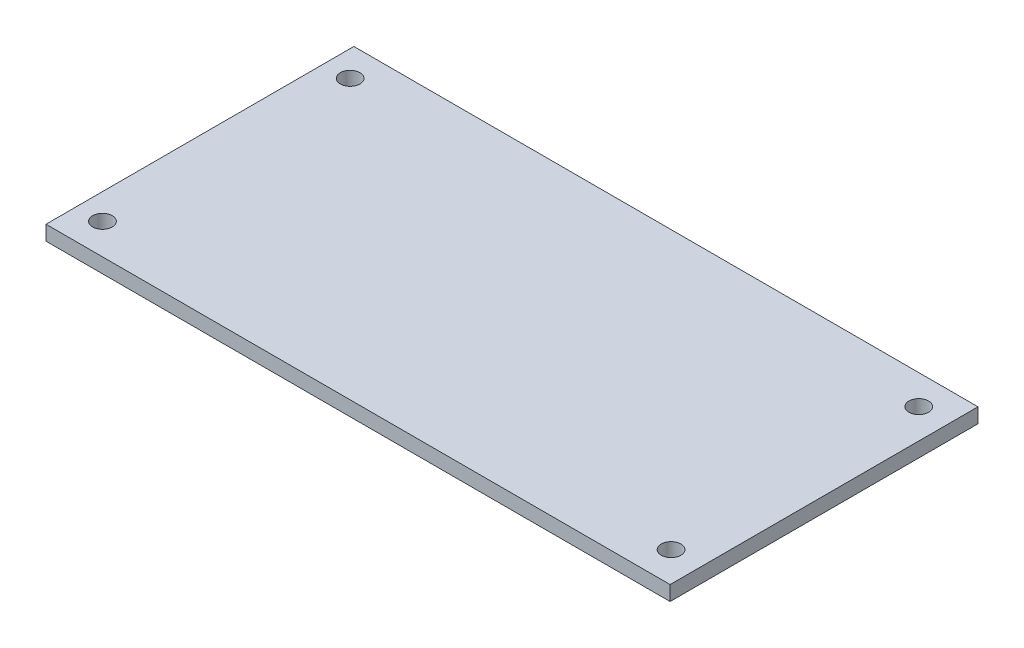
ISO-10303-21;
HEADER;
FILE_DESCRIPTION(('STEP AP214'),'2;1');
FILE_NAME('part.step','',(''),(''),'','','');
FILE_SCHEMA(('AUTOMOTIVE_DESIGN { 1 0 10303 214 1 1 1 1 }'));
ENDSEC;
DATA;
#1=APPLICATION_CONTEXT('core data for automotive mechanical design processes');
#2=APPLICATION_PROTOCOL_DEFINITION('international standard','automotive_design',2000,#1);
#3=PRODUCT_CONTEXT('',#1,'mechanical');
#4=PRODUCT('Part','Part','',(#3));
#5=PRODUCT_RELATED_PRODUCT_CATEGORY('part','',(#4));
#6=PRODUCT_DEFINITION_FORMATION('','',#4);
#7=PRODUCT_DEFINITION_CONTEXT('part definition',#1,'design');
#8=PRODUCT_DEFINITION('design','',#6,#7);
#9=PRODUCT_DEFINITION_SHAPE('','',#8);
#10=(LENGTH_UNIT() NAMED_UNIT(*) SI_UNIT(.MILLI.,.METRE.));
#11=(NAMED_UNIT(*) PLANE_ANGLE_UNIT() SI_UNIT($,.RADIAN.));
#12=(NAMED_UNIT(*) SI_UNIT($,.STERADIAN.) SOLID_ANGLE_UNIT());
#13=UNCERTAINTY_MEASURE_WITH_UNIT(LENGTH_MEASURE(1.E-05),#10,'distance_accuracy_value','');
#14=(GEOMETRIC_REPRESENTATION_CONTEXT(3) GLOBAL_UNCERTAINTY_ASSIGNED_CONTEXT((#13)) GLOBAL_UNIT_ASSIGNED_CONTEXT((#10,
#11,#12)) REPRESENTATION_CONTEXT('',''));
#15=CARTESIAN_POINT('',(0.,0.,0.));
#16=DIRECTION('',(0.,0.,1.));
#17=DIRECTION('',(1.,0.,0.));
#18=AXIS2_PLACEMENT_3D('',#15,#16,#17);
#19=CARTESIAN_POINT('',(0.,3.,0.));
#20=DIRECTION('',(0.,1.,0.));
#21=DIRECTION('',(0.,0.,1.));
#22=AXIS2_PLACEMENT_3D('',#19,#20,#21);
#23=PLANE('',#22);
#24=CARTESIAN_POINT('',(-58.3565,3.,25.11425));
#25=DIRECTION('',(0.,1.,0.));
#26=DIRECTION('',(0.,0.,1.));
#27=AXIS2_PLACEMENT_3D('',#24,#25,#26);
#28=CIRCLE('',#27,1.99999854);
#29=CARTESIAN_POINT('',(-58.3565,3.,27.11424854));
#30=VERTEX_POINT('',#29);
#31=EDGE_CURVE('E122',#30,#30,#28,.T.);
#32=ORIENTED_EDGE('',*,*,#31,.F.);
#33=EDGE_LOOP('',(#32));
#34=FACE_BOUND('',#33,.T.);
#35=CARTESIAN_POINT('',(57.531,3.,-25.36825));
#36=DIRECTION('',(0.,1.,0.));
#37=DIRECTION('',(0.,0.,1.));
#38=AXIS2_PLACEMENT_3D('',#35,#36,#37);
#39=CIRCLE('',#38,1.99999853999999);
#40=CARTESIAN_POINT('',(57.531,3.,-23.36825146));
#41=VERTEX_POINT('',#40);
#42=EDGE_CURVE('E101',#41,#41,#39,.T.);
#43=ORIENTED_EDGE('',*,*,#42,.F.);
#44=EDGE_LOOP('',(#43));
#45=FACE_BOUND('',#44,.T.);
#46=DIRECTION('',(0.,0.,-1.));
#47=VECTOR('',#46,1.);
#48=CARTESIAN_POINT('',(63.6,3.,-31.375));
#49=LINE('',#48,#47);
#50=CARTESIAN_POINT('',(63.6,3.,31.375));
#51=VERTEX_POINT('',#50);
#52=CARTESIAN_POINT('',(63.6,3.,-31.375));
#53=VERTEX_POINT('',#52);
#54=EDGE_CURVE('E86',#51,#53,#49,.T.);
#55=ORIENTED_EDGE('',*,*,#54,.T.);
#56=DIRECTION('',(-1.,0.,0.));
#57=VECTOR('',#56,1.);
#58=CARTESIAN_POINT('',(-63.6,3.,-31.375));
#59=LINE('',#58,#57);
#60=CARTESIAN_POINT('',(-63.6,3.,-31.375));
#61=VERTEX_POINT('',#60);
#62=EDGE_CURVE('E81',#53,#61,#59,.T.);
#63=ORIENTED_EDGE('',*,*,#62,.T.);
#64=DIRECTION('',(0.,0.,1.));
#65=VECTOR('',#64,1.);
#66=CARTESIAN_POINT('',(-63.6,3.,-31.375));
#67=LINE('',#66,#65);
#68=CARTESIAN_POINT('',(-63.6,3.,31.375));
#69=VERTEX_POINT('',#68);
#70=EDGE_CURVE('E84',#61,#69,#67,.T.);
#71=ORIENTED_EDGE('',*,*,#70,.T.);
#72=DIRECTION('',(1.,0.,0.));
#73=VECTOR('',#72,1.);
#74=CARTESIAN_POINT('',(-63.6,3.,31.375));
#75=LINE('',#74,#73);
#76=EDGE_CURVE('E51',#69,#51,#75,.T.);
#77=ORIENTED_EDGE('',*,*,#76,.T.);
#78=EDGE_LOOP('',(#55,#63,#71,#77));
#79=FACE_BOUND('',#78,.T.);
#80=CARTESIAN_POINT('',(57.531,3.,25.11425));
#81=DIRECTION('',(0.,1.,0.));
#82=DIRECTION('',(0.,0.,1.));
#83=AXIS2_PLACEMENT_3D('',#80,#81,#82);
#84=CIRCLE('',#83,1.99999853999999);
#85=CARTESIAN_POINT('',(57.531,3.,27.11424854));
#86=VERTEX_POINT('',#85);
#87=EDGE_CURVE('E116',#86,#86,#84,.T.);
#88=ORIENTED_EDGE('',*,*,#87,.F.);
#89=EDGE_LOOP('',(#88));
#90=FACE_BOUND('',#89,.T.);
#91=CARTESIAN_POINT('',(-58.3565,3.,-25.36825));
#92=DIRECTION('',(0.,1.,0.));
#93=DIRECTION('',(0.,0.,1.));
#94=AXIS2_PLACEMENT_3D('',#91,#92,#93);
#95=CIRCLE('',#94,1.99999854);
#96=CARTESIAN_POINT('',(-58.3565,3.,-23.36825146));
#97=VERTEX_POINT('',#96);
#98=EDGE_CURVE('E128',#97,#97,#95,.T.);
#99=ORIENTED_EDGE('',*,*,#98,.F.);
#100=EDGE_LOOP('',(#99));
#101=FACE_BOUND('',#100,.T.);
#102=ADVANCED_FACE('F34',(#34,#45,#79,#90,#101),#23,.T.);
#103=CARTESIAN_POINT('',(0.,0.,0.));
#104=DIRECTION('',(0.,1.,0.));
#105=DIRECTION('',(0.,0.,1.));
#106=AXIS2_PLACEMENT_3D('',#103,#104,#105);
#107=PLANE('',#106);
#108=DIRECTION('',(0.,0.,-1.));
#109=VECTOR('',#108,1.);
#110=CARTESIAN_POINT('',(63.6,0.,-31.375));
#111=LINE('',#110,#109);
#112=CARTESIAN_POINT('',(63.6,0.,31.375));
#113=VERTEX_POINT('',#112);
#114=CARTESIAN_POINT('',(63.6,0.,-31.375));
#115=VERTEX_POINT('',#114);
#116=EDGE_CURVE('E98',#113,#115,#111,.T.);
#117=ORIENTED_EDGE('',*,*,#116,.F.);
#118=DIRECTION('',(1.,0.,0.));
#119=VECTOR('',#118,1.);
#120=CARTESIAN_POINT('',(-63.6,0.,31.375));
#121=LINE('',#120,#119);
#122=CARTESIAN_POINT('',(-63.6,0.,31.375));
#123=VERTEX_POINT('',#122);
#124=EDGE_CURVE('E74',#123,#113,#121,.T.);
#125=ORIENTED_EDGE('',*,*,#124,.F.);
#126=DIRECTION('',(0.,0.,1.));
#127=VECTOR('',#126,1.);
#128=CARTESIAN_POINT('',(-63.6,0.,-31.375));
#129=LINE('',#128,#127);
#130=CARTESIAN_POINT('',(-63.6,0.,-31.375));
#131=VERTEX_POINT('',#130);
#132=EDGE_CURVE('E68',#131,#123,#129,.T.);
#133=ORIENTED_EDGE('',*,*,#132,.F.);
#134=DIRECTION('',(-1.,0.,0.));
#135=VECTOR('',#134,1.);
#136=CARTESIAN_POINT('',(-63.6,0.,-31.375));
#137=LINE('',#136,#135);
#138=EDGE_CURVE('E90',#115,#131,#137,.T.);
#139=ORIENTED_EDGE('',*,*,#138,.F.);
#140=EDGE_LOOP('',(#117,#125,#133,#139));
#141=FACE_BOUND('',#140,.T.);
#142=CARTESIAN_POINT('',(57.531,0.,-25.36825));
#143=DIRECTION('',(0.,1.,0.));
#144=DIRECTION('',(0.,0.,1.));
#145=AXIS2_PLACEMENT_3D('',#142,#143,#144);
#146=CIRCLE('',#145,1.99999853999999);
#147=CARTESIAN_POINT('',(57.531,0.,-23.36825146));
#148=VERTEX_POINT('',#147);
#149=EDGE_CURVE('E113',#148,#148,#146,.T.);
#150=ORIENTED_EDGE('',*,*,#149,.T.);
#151=EDGE_LOOP('',(#150));
#152=FACE_BOUND('',#151,.T.);
#153=CARTESIAN_POINT('',(57.531,0.,25.11425));
#154=DIRECTION('',(0.,1.,0.));
#155=DIRECTION('',(0.,0.,1.));
#156=AXIS2_PLACEMENT_3D('',#153,#154,#155);
#157=CIRCLE('',#156,1.99999853999999);
#158=CARTESIAN_POINT('',(57.531,0.,27.11424854));
#159=VERTEX_POINT('',#158);
#160=EDGE_CURVE('E119',#159,#159,#157,.T.);
#161=ORIENTED_EDGE('',*,*,#160,.T.);
#162=EDGE_LOOP('',(#161));
#163=FACE_BOUND('',#162,.T.);
#164=CARTESIAN_POINT('',(-58.3565,0.,25.11425));
#165=DIRECTION('',(0.,1.,0.));
#166=DIRECTION('',(0.,0.,1.));
#167=AXIS2_PLACEMENT_3D('',#164,#165,#166);
#168=CIRCLE('',#167,1.99999854);
#169=CARTESIAN_POINT('',(-58.3565,0.,27.11424854));
#170=VERTEX_POINT('',#169);
#171=EDGE_CURVE('E125',#170,#170,#168,.T.);
#172=ORIENTED_EDGE('',*,*,#171,.T.);
#173=EDGE_LOOP('',(#172));
#174=FACE_BOUND('',#173,.T.);
#175=CARTESIAN_POINT('',(-58.3565,0.,-25.36825));
#176=DIRECTION('',(0.,1.,0.));
#177=DIRECTION('',(0.,0.,1.));
#178=AXIS2_PLACEMENT_3D('',#175,#176,#177);
#179=CIRCLE('',#178,1.99999854);
#180=CARTESIAN_POINT('',(-58.3565,0.,-23.36825146));
#181=VERTEX_POINT('',#180);
#182=EDGE_CURVE('E131',#181,#181,#179,.T.);
#183=ORIENTED_EDGE('',*,*,#182,.T.);
#184=EDGE_LOOP('',(#183));
#185=FACE_BOUND('',#184,.T.);
#186=ADVANCED_FACE('F109',(#141,#152,#163,#174,#185),#107,.F.);
#187=CARTESIAN_POINT('',(63.6,3.,-31.375));
#188=DIRECTION('',(-1.,0.,0.));
#189=DIRECTION('',(0.,0.,1.));
#190=AXIS2_PLACEMENT_3D('',#187,#188,#189);
#191=PLANE('',#190);
#192=ORIENTED_EDGE('',*,*,#116,.T.);
#193=DIRECTION('',(0.,-1.,0.));
#194=VECTOR('',#193,1.);
#195=CARTESIAN_POINT('',(63.6,3.,-31.375));
#196=LINE('',#195,#194);
#197=EDGE_CURVE('E11',#53,#115,#196,.T.);
#198=ORIENTED_EDGE('',*,*,#197,.F.);
#199=ORIENTED_EDGE('',*,*,#54,.F.);
#200=DIRECTION('',(0.,-1.,0.));
#201=VECTOR('',#200,1.);
#202=CARTESIAN_POINT('',(63.6,3.,31.375));
#203=LINE('',#202,#201);
#204=EDGE_CURVE('E94',#51,#113,#203,.T.);
#205=ORIENTED_EDGE('',*,*,#204,.T.);
#206=EDGE_LOOP('',(#192,#198,#199,#205));
#207=FACE_BOUND('',#206,.T.);
#208=ADVANCED_FACE('F36',(#207),#191,.F.);
#209=CARTESIAN_POINT('',(-63.6,3.,-31.375));
#210=DIRECTION('',(0.,0.,1.));
#211=DIRECTION('',(1.,0.,0.));
#212=AXIS2_PLACEMENT_3D('',#209,#210,#211);
#213=PLANE('',#212);
#214=ORIENTED_EDGE('',*,*,#138,.T.);
#215=DIRECTION('',(0.,-1.,0.));
#216=VECTOR('',#215,1.);
#217=CARTESIAN_POINT('',(-63.6,3.,-31.375));
#218=LINE('',#217,#216);
#219=EDGE_CURVE('E43',#61,#131,#218,.T.);
#220=ORIENTED_EDGE('',*,*,#219,.F.);
#221=ORIENTED_EDGE('',*,*,#62,.F.);
#222=ORIENTED_EDGE('',*,*,#197,.T.);
#223=EDGE_LOOP('',(#214,#220,#221,#222));
#224=FACE_BOUND('',#223,.T.);
#225=ADVANCED_FACE('F89',(#224),#213,.F.);
#226=CARTESIAN_POINT('',(-63.6,3.,-31.375));
#227=DIRECTION('',(1.,0.,0.));
#228=DIRECTION('',(0.,0.,-1.));
#229=AXIS2_PLACEMENT_3D('',#226,#227,#228);
#230=PLANE('',#229);
#231=ORIENTED_EDGE('',*,*,#132,.T.);
#232=DIRECTION('',(0.,-1.,0.));
#233=VECTOR('',#232,1.);
#234=CARTESIAN_POINT('',(-63.6,3.,31.375));
#235=LINE('',#234,#233);
#236=EDGE_CURVE('E91',#69,#123,#235,.T.);
#237=ORIENTED_EDGE('',*,*,#236,.F.);
#238=ORIENTED_EDGE('',*,*,#70,.F.);
#239=ORIENTED_EDGE('',*,*,#219,.T.);
#240=EDGE_LOOP('',(#231,#237,#238,#239));
#241=FACE_BOUND('',#240,.T.);
#242=ADVANCED_FACE('F92',(#241),#230,.F.);
#243=CARTESIAN_POINT('',(-63.6,3.,31.375));
#244=DIRECTION('',(0.,0.,-1.));
#245=DIRECTION('',(-1.,0.,0.));
#246=AXIS2_PLACEMENT_3D('',#243,#244,#245);
#247=PLANE('',#246);
#248=ORIENTED_EDGE('',*,*,#124,.T.);
#249=ORIENTED_EDGE('',*,*,#204,.F.);
#250=ORIENTED_EDGE('',*,*,#76,.F.);
#251=ORIENTED_EDGE('',*,*,#236,.T.);
#252=EDGE_LOOP('',(#248,#249,#250,#251));
#253=FACE_BOUND('',#252,.T.);
#254=ADVANCED_FACE('F106',(#253),#247,.F.);
#255=CARTESIAN_POINT('',(57.531,3.,-25.36825));
#256=DIRECTION('',(0.,-1.,0.));
#257=DIRECTION('',(0.,0.,-1.));
#258=AXIS2_PLACEMENT_3D('',#255,#256,#257);
#259=CYLINDRICAL_SURFACE('',#258,1.99999853999999);
#260=ORIENTED_EDGE('',*,*,#42,.T.);
#261=EDGE_LOOP('',(#260));
#262=FACE_BOUND('',#261,.T.);
#263=ORIENTED_EDGE('',*,*,#149,.F.);
#264=EDGE_LOOP('',(#263));
#265=FACE_BOUND('',#264,.T.);
#266=ADVANCED_FACE('F150',(#262,#265),#259,.F.);
#267=CARTESIAN_POINT('',(57.531,3.,25.11425));
#268=DIRECTION('',(0.,-1.,0.));
#269=DIRECTION('',(0.,0.,-1.));
#270=AXIS2_PLACEMENT_3D('',#267,#268,#269);
#271=CYLINDRICAL_SURFACE('',#270,1.99999853999999);
#272=ORIENTED_EDGE('',*,*,#87,.T.);
#273=EDGE_LOOP('',(#272));
#274=FACE_BOUND('',#273,.T.);
#275=ORIENTED_EDGE('',*,*,#160,.F.);
#276=EDGE_LOOP('',(#275));
#277=FACE_BOUND('',#276,.T.);
#278=ADVANCED_FACE('F196',(#274,#277),#271,.F.);
#279=CARTESIAN_POINT('',(-58.3565,3.,25.11425));
#280=DIRECTION('',(0.,-1.,0.));
#281=DIRECTION('',(0.,0.,-1.));
#282=AXIS2_PLACEMENT_3D('',#279,#280,#281);
#283=CYLINDRICAL_SURFACE('',#282,1.99999854);
#284=ORIENTED_EDGE('',*,*,#31,.T.);
#285=EDGE_LOOP('',(#284));
#286=FACE_BOUND('',#285,.T.);
#287=ORIENTED_EDGE('',*,*,#171,.F.);
#288=EDGE_LOOP('',(#287));
#289=FACE_BOUND('',#288,.T.);
#290=ADVANCED_FACE('F204',(#286,#289),#283,.F.);
#291=CARTESIAN_POINT('',(-58.3565,3.,-25.36825));
#292=DIRECTION('',(0.,-1.,0.));
#293=DIRECTION('',(0.,0.,-1.));
#294=AXIS2_PLACEMENT_3D('',#291,#292,#293);
#295=CYLINDRICAL_SURFACE('',#294,1.99999854);
#296=ORIENTED_EDGE('',*,*,#98,.T.);
#297=EDGE_LOOP('',(#296));
#298=FACE_BOUND('',#297,.T.);
#299=ORIENTED_EDGE('',*,*,#182,.F.);
#300=EDGE_LOOP('',(#299));
#301=FACE_BOUND('',#300,.T.);
#302=ADVANCED_FACE('F137',(#298,#301),#295,.F.);
#303=CLOSED_SHELL('',(#102,#186,#208,#225,#242,#254,#266,#278,#290,#302));
#304=MANIFOLD_SOLID_BREP('B2',#303);
#305=ADVANCED_BREP_SHAPE_REPRESENTATION('',(#18,#304),#14);
#306=SHAPE_DEFINITION_REPRESENTATION(#9,#305);
ENDSEC;
END-ISO-10303-21;
